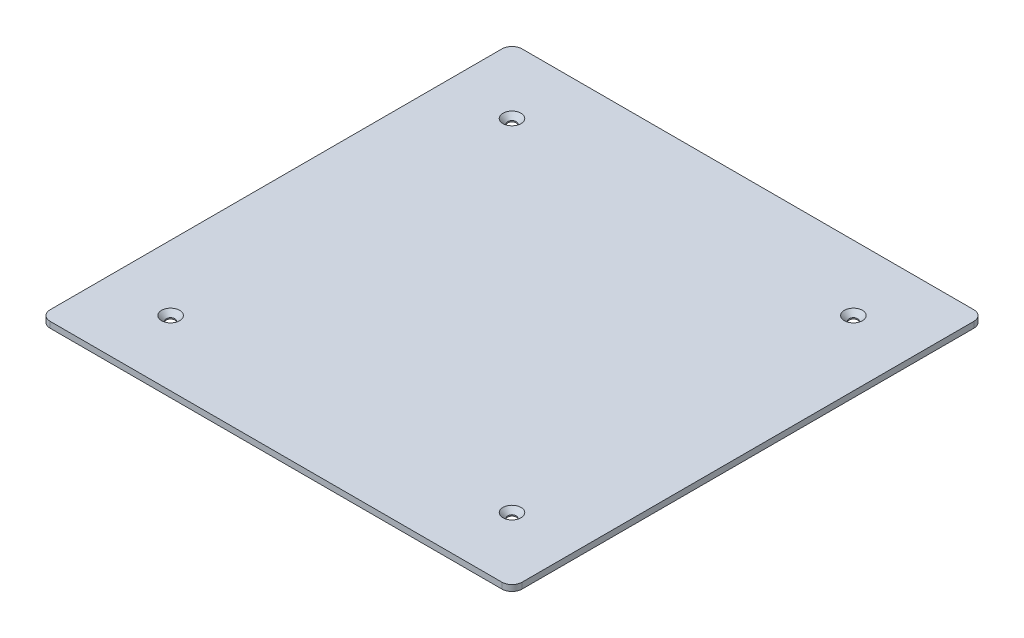
ISO-10303-21;
HEADER;
FILE_DESCRIPTION(('STEP AP214'),'2;1');
FILE_NAME('part.step','',(''),(''),'','','');
FILE_SCHEMA(('AUTOMOTIVE_DESIGN { 1 0 10303 214 1 1 1 1 }'));
ENDSEC;
DATA;
#1=APPLICATION_CONTEXT('core data for automotive mechanical design processes');
#2=APPLICATION_PROTOCOL_DEFINITION('international standard','automotive_design',2000,#1);
#3=PRODUCT_CONTEXT('',#1,'mechanical');
#4=PRODUCT('Part','Part','',(#3));
#5=PRODUCT_RELATED_PRODUCT_CATEGORY('part','',(#4));
#6=PRODUCT_DEFINITION_FORMATION('','',#4);
#7=PRODUCT_DEFINITION_CONTEXT('part definition',#1,'design');
#8=PRODUCT_DEFINITION('design','',#6,#7);
#9=PRODUCT_DEFINITION_SHAPE('','',#8);
#10=(LENGTH_UNIT() NAMED_UNIT(*) SI_UNIT(.MILLI.,.METRE.));
#11=(NAMED_UNIT(*) PLANE_ANGLE_UNIT() SI_UNIT($,.RADIAN.));
#12=(NAMED_UNIT(*) SI_UNIT($,.STERADIAN.) SOLID_ANGLE_UNIT());
#13=UNCERTAINTY_MEASURE_WITH_UNIT(LENGTH_MEASURE(1.E-05),#10,'distance_accuracy_value','');
#14=(GEOMETRIC_REPRESENTATION_CONTEXT(3) GLOBAL_UNCERTAINTY_ASSIGNED_CONTEXT((#13)) GLOBAL_UNIT_ASSIGNED_CONTEXT((#10,
#11,#12)) REPRESENTATION_CONTEXT('',''));
#15=CARTESIAN_POINT('',(0.,0.,0.));
#16=DIRECTION('',(0.,0.,1.));
#17=DIRECTION('',(1.,0.,0.));
#18=AXIS2_PLACEMENT_3D('',#15,#16,#17);
#19=CARTESIAN_POINT('',(0.,3.,117.5));
#20=DIRECTION('',(0.,0.,-1.));
#21=DIRECTION('',(-1.,0.,0.));
#22=AXIS2_PLACEMENT_3D('',#19,#20,#21);
#23=PLANE('',#22);
#24=DIRECTION('',(1.,0.,0.));
#25=VECTOR('',#24,1.);
#26=CARTESIAN_POINT('',(0.,3.,117.5));
#27=LINE('',#26,#25);
#28=CARTESIAN_POINT('',(-112.5,3.,117.5));
#29=VERTEX_POINT('',#28);
#30=CARTESIAN_POINT('',(112.5,3.,117.5));
#31=VERTEX_POINT('',#30);
#32=EDGE_CURVE('E130',#29,#31,#27,.T.);
#33=ORIENTED_EDGE('',*,*,#32,.F.);
#34=DIRECTION('',(0.,-1.,0.));
#35=VECTOR('',#34,1.);
#36=CARTESIAN_POINT('',(-112.5,0.,117.5));
#37=LINE('',#36,#35);
#38=CARTESIAN_POINT('',(-112.5,0.,117.5));
#39=VERTEX_POINT('',#38);
#40=EDGE_CURVE('E115',#29,#39,#37,.T.);
#41=ORIENTED_EDGE('',*,*,#40,.T.);
#42=DIRECTION('',(1.,0.,0.));
#43=VECTOR('',#42,1.);
#44=CARTESIAN_POINT('',(0.,0.,117.5));
#45=LINE('',#44,#43);
#46=CARTESIAN_POINT('',(112.5,0.,117.5));
#47=VERTEX_POINT('',#46);
#48=EDGE_CURVE('E127',#39,#47,#45,.T.);
#49=ORIENTED_EDGE('',*,*,#48,.T.);
#50=DIRECTION('',(0.,-1.,0.));
#51=VECTOR('',#50,1.);
#52=CARTESIAN_POINT('',(112.5,3.,117.5));
#53=LINE('',#52,#51);
#54=EDGE_CURVE('E132',#47,#31,#53,.F.);
#55=ORIENTED_EDGE('',*,*,#54,.T.);
#56=EDGE_LOOP('',(#33,#41,#49,#55));
#57=FACE_BOUND('',#56,.T.);
#58=ADVANCED_FACE('F43',(#57),#23,.F.);
#59=CARTESIAN_POINT('',(117.5,3.,0.));
#60=DIRECTION('',(-1.,0.,0.));
#61=DIRECTION('',(0.,0.,1.));
#62=AXIS2_PLACEMENT_3D('',#59,#60,#61);
#63=PLANE('',#62);
#64=DIRECTION('',(0.,0.,-1.));
#65=VECTOR('',#64,1.);
#66=CARTESIAN_POINT('',(117.5,0.,0.));
#67=LINE('',#66,#65);
#68=CARTESIAN_POINT('',(117.5,0.,112.5));
#69=VERTEX_POINT('',#68);
#70=CARTESIAN_POINT('',(117.5,0.,-112.5));
#71=VERTEX_POINT('',#70);
#72=EDGE_CURVE('E136',#69,#71,#67,.T.);
#73=ORIENTED_EDGE('',*,*,#72,.T.);
#74=DIRECTION('',(0.,-1.,0.));
#75=VECTOR('',#74,1.);
#76=CARTESIAN_POINT('',(117.5,3.,-112.5));
#77=LINE('',#76,#75);
#78=CARTESIAN_POINT('',(117.5,3.,-112.5));
#79=VERTEX_POINT('',#78);
#80=EDGE_CURVE('E175',#71,#79,#77,.F.);
#81=ORIENTED_EDGE('',*,*,#80,.T.);
#82=DIRECTION('',(0.,0.,-1.));
#83=VECTOR('',#82,1.);
#84=CARTESIAN_POINT('',(117.5,3.,0.));
#85=LINE('',#84,#83);
#86=CARTESIAN_POINT('',(117.5,3.,112.5));
#87=VERTEX_POINT('',#86);
#88=EDGE_CURVE('E219',#87,#79,#85,.T.);
#89=ORIENTED_EDGE('',*,*,#88,.F.);
#90=DIRECTION('',(0.,-1.,0.));
#91=VECTOR('',#90,1.);
#92=CARTESIAN_POINT('',(117.5,3.,112.5));
#93=LINE('',#92,#91);
#94=EDGE_CURVE('E172',#87,#69,#93,.T.);
#95=ORIENTED_EDGE('',*,*,#94,.T.);
#96=EDGE_LOOP('',(#73,#81,#89,#95));
#97=FACE_BOUND('',#96,.T.);
#98=ADVANCED_FACE('F250',(#97),#63,.F.);
#99=CARTESIAN_POINT('',(0.,3.,-117.5));
#100=DIRECTION('',(0.,0.,-1.));
#101=DIRECTION('',(-1.,0.,0.));
#102=AXIS2_PLACEMENT_3D('',#99,#100,#101);
#103=PLANE('',#102);
#104=DIRECTION('',(1.,0.,0.));
#105=VECTOR('',#104,1.);
#106=CARTESIAN_POINT('',(0.,0.,-117.5));
#107=LINE('',#106,#105);
#108=CARTESIAN_POINT('',(-112.5,0.,-117.5));
#109=VERTEX_POINT('',#108);
#110=CARTESIAN_POINT('',(112.5,0.,-117.5));
#111=VERTEX_POINT('',#110);
#112=EDGE_CURVE('E140',#109,#111,#107,.T.);
#113=ORIENTED_EDGE('',*,*,#112,.F.);
#114=DIRECTION('',(0.,-1.,0.));
#115=VECTOR('',#114,1.);
#116=CARTESIAN_POINT('',(-112.5,3.,-117.5));
#117=LINE('',#116,#115);
#118=CARTESIAN_POINT('',(-112.5,3.,-117.5));
#119=VERTEX_POINT('',#118);
#120=EDGE_CURVE('E66',#109,#119,#117,.F.);
#121=ORIENTED_EDGE('',*,*,#120,.T.);
#122=DIRECTION('',(1.,0.,0.));
#123=VECTOR('',#122,1.);
#124=CARTESIAN_POINT('',(0.,3.,-117.5));
#125=LINE('',#124,#123);
#126=CARTESIAN_POINT('',(112.5,3.,-117.5));
#127=VERTEX_POINT('',#126);
#128=EDGE_CURVE('E218',#119,#127,#125,.T.);
#129=ORIENTED_EDGE('',*,*,#128,.T.);
#130=DIRECTION('',(0.,-1.,0.));
#131=VECTOR('',#130,1.);
#132=CARTESIAN_POINT('',(112.5,0.,-117.5));
#133=LINE('',#132,#131);
#134=EDGE_CURVE('E168',#127,#111,#133,.T.);
#135=ORIENTED_EDGE('',*,*,#134,.T.);
#136=EDGE_LOOP('',(#113,#121,#129,#135));
#137=FACE_BOUND('',#136,.T.);
#138=ADVANCED_FACE('F255',(#137),#103,.T.);
#139=CARTESIAN_POINT('',(-117.5,3.,0.));
#140=DIRECTION('',(-1.,0.,0.));
#141=DIRECTION('',(0.,0.,1.));
#142=AXIS2_PLACEMENT_3D('',#139,#140,#141);
#143=PLANE('',#142);
#144=DIRECTION('',(0.,0.,-1.));
#145=VECTOR('',#144,1.);
#146=CARTESIAN_POINT('',(-117.5,0.,0.));
#147=LINE('',#146,#145);
#148=CARTESIAN_POINT('',(-117.5,0.,112.5));
#149=VERTEX_POINT('',#148);
#150=CARTESIAN_POINT('',(-117.5,0.,-112.5));
#151=VERTEX_POINT('',#150);
#152=EDGE_CURVE('E151',#149,#151,#147,.T.);
#153=ORIENTED_EDGE('',*,*,#152,.F.);
#154=DIRECTION('',(0.,-1.,0.));
#155=VECTOR('',#154,1.);
#156=CARTESIAN_POINT('',(-117.5,3.,112.5));
#157=LINE('',#156,#155);
#158=CARTESIAN_POINT('',(-117.5,3.,112.5));
#159=VERTEX_POINT('',#158);
#160=EDGE_CURVE('E116',#149,#159,#157,.F.);
#161=ORIENTED_EDGE('',*,*,#160,.T.);
#162=DIRECTION('',(0.,0.,-1.));
#163=VECTOR('',#162,1.);
#164=CARTESIAN_POINT('',(-117.5,3.,0.));
#165=LINE('',#164,#163);
#166=CARTESIAN_POINT('',(-117.5,3.,-112.5));
#167=VERTEX_POINT('',#166);
#168=EDGE_CURVE('E146',#159,#167,#165,.T.);
#169=ORIENTED_EDGE('',*,*,#168,.T.);
#170=DIRECTION('',(0.,-1.,0.));
#171=VECTOR('',#170,1.);
#172=CARTESIAN_POINT('',(-117.5,3.,-112.5));
#173=LINE('',#172,#171);
#174=EDGE_CURVE('E121',#167,#151,#173,.T.);
#175=ORIENTED_EDGE('',*,*,#174,.T.);
#176=EDGE_LOOP('',(#153,#161,#169,#175));
#177=FACE_BOUND('',#176,.T.);
#178=ADVANCED_FACE('F209',(#177),#143,.T.);
#179=CARTESIAN_POINT('',(0.,3.,0.));
#180=DIRECTION('',(0.,1.,0.));
#181=DIRECTION('',(0.,0.,1.));
#182=AXIS2_PLACEMENT_3D('',#179,#180,#181);
#183=PLANE('',#182);
#184=CARTESIAN_POINT('',(-85.,3.,85.));
#185=DIRECTION('',(0.,1.,0.));
#186=DIRECTION('',(0.,0.,1.));
#187=AXIS2_PLACEMENT_3D('',#184,#185,#186);
#188=CIRCLE('',#187,4.50000000000012);
#189=CARTESIAN_POINT('',(-85.,3.,89.5000000000001));
#190=VERTEX_POINT('',#189);
#191=EDGE_CURVE('E186',#190,#190,#188,.F.);
#192=ORIENTED_EDGE('',*,*,#191,.T.);
#193=EDGE_LOOP('',(#192));
#194=FACE_BOUND('',#193,.T.);
#195=CARTESIAN_POINT('',(85.,3.,85.));
#196=DIRECTION('',(0.,1.,0.));
#197=DIRECTION('',(0.,0.,1.));
#198=AXIS2_PLACEMENT_3D('',#195,#196,#197);
#199=CIRCLE('',#198,4.50000000000012);
#200=CARTESIAN_POINT('',(85.,3.,89.5000000000001));
#201=VERTEX_POINT('',#200);
#202=EDGE_CURVE('E183',#201,#201,#199,.F.);
#203=ORIENTED_EDGE('',*,*,#202,.T.);
#204=EDGE_LOOP('',(#203));
#205=FACE_BOUND('',#204,.T.);
#206=CARTESIAN_POINT('',(85.,3.,-85.));
#207=DIRECTION('',(0.,1.,0.));
#208=DIRECTION('',(0.,0.,1.));
#209=AXIS2_PLACEMENT_3D('',#206,#207,#208);
#210=CIRCLE('',#209,4.50000000000012);
#211=CARTESIAN_POINT('',(85.,3.,-80.4999999999999));
#212=VERTEX_POINT('',#211);
#213=EDGE_CURVE('E180',#212,#212,#210,.F.);
#214=ORIENTED_EDGE('',*,*,#213,.T.);
#215=EDGE_LOOP('',(#214));
#216=FACE_BOUND('',#215,.T.);
#217=CARTESIAN_POINT('',(-85.,3.,-85.));
#218=DIRECTION('',(0.,1.,0.));
#219=DIRECTION('',(0.,0.,1.));
#220=AXIS2_PLACEMENT_3D('',#217,#218,#219);
#221=CIRCLE('',#220,4.50000000000012);
#222=CARTESIAN_POINT('',(-85.,3.,-80.4999999999999));
#223=VERTEX_POINT('',#222);
#224=EDGE_CURVE('E177',#223,#223,#221,.F.);
#225=ORIENTED_EDGE('',*,*,#224,.T.);
#226=EDGE_LOOP('',(#225));
#227=FACE_BOUND('',#226,.T.);
#228=ORIENTED_EDGE('',*,*,#168,.F.);
#229=CARTESIAN_POINT('',(-112.5,3.,112.5));
#230=DIRECTION('',(0.,1.,0.));
#231=DIRECTION('',(0.,0.,1.));
#232=AXIS2_PLACEMENT_3D('',#229,#230,#231);
#233=CIRCLE('',#232,5.);
#234=EDGE_CURVE('E166',#159,#29,#233,.T.);
#235=ORIENTED_EDGE('',*,*,#234,.T.);
#236=ORIENTED_EDGE('',*,*,#32,.T.);
#237=CARTESIAN_POINT('',(112.5,3.,112.5));
#238=DIRECTION('',(0.,1.,0.));
#239=DIRECTION('',(0.,0.,1.));
#240=AXIS2_PLACEMENT_3D('',#237,#238,#239);
#241=CIRCLE('',#240,5.);
#242=EDGE_CURVE('E161',#31,#87,#241,.T.);
#243=ORIENTED_EDGE('',*,*,#242,.T.);
#244=ORIENTED_EDGE('',*,*,#88,.T.);
#245=CARTESIAN_POINT('',(112.5,3.,-112.5));
#246=DIRECTION('',(0.,1.,0.));
#247=DIRECTION('',(0.,0.,1.));
#248=AXIS2_PLACEMENT_3D('',#245,#246,#247);
#249=CIRCLE('',#248,5.);
#250=EDGE_CURVE('E59',#79,#127,#249,.T.);
#251=ORIENTED_EDGE('',*,*,#250,.T.);
#252=ORIENTED_EDGE('',*,*,#128,.F.);
#253=CARTESIAN_POINT('',(-112.5,3.,-112.5));
#254=DIRECTION('',(0.,1.,0.));
#255=DIRECTION('',(0.,0.,1.));
#256=AXIS2_PLACEMENT_3D('',#253,#254,#255);
#257=CIRCLE('',#256,5.);
#258=EDGE_CURVE('E164',#119,#167,#257,.T.);
#259=ORIENTED_EDGE('',*,*,#258,.T.);
#260=EDGE_LOOP('',(#228,#235,#236,#243,#244,#251,#252,#259));
#261=FACE_BOUND('',#260,.T.);
#262=ADVANCED_FACE('F206',(#194,#205,#216,#227,#261),#183,.T.);
#263=CARTESIAN_POINT('',(0.,0.,0.));
#264=DIRECTION('',(0.,1.,0.));
#265=DIRECTION('',(0.,0.,1.));
#266=AXIS2_PLACEMENT_3D('',#263,#264,#265);
#267=PLANE('',#266);
#268=CARTESIAN_POINT('',(-85.,0.,-85.));
#269=DIRECTION('',(0.,-1.,0.));
#270=DIRECTION('',(0.,0.,-1.));
#271=AXIS2_PLACEMENT_3D('',#268,#269,#270);
#272=CIRCLE('',#271,2.1);
#273=CARTESIAN_POINT('',(-85.,0.,-87.1));
#274=VERTEX_POINT('',#273);
#275=EDGE_CURVE('E224',#274,#274,#272,.T.);
#276=ORIENTED_EDGE('',*,*,#275,.F.);
#277=EDGE_LOOP('',(#276));
#278=FACE_BOUND('',#277,.T.);
#279=CARTESIAN_POINT('',(85.,0.,85.));
#280=DIRECTION('',(0.,-1.,0.));
#281=DIRECTION('',(0.,0.,-1.));
#282=AXIS2_PLACEMENT_3D('',#279,#280,#281);
#283=CIRCLE('',#282,2.1);
#284=CARTESIAN_POINT('',(85.,0.,82.9));
#285=VERTEX_POINT('',#284);
#286=EDGE_CURVE('E227',#285,#285,#283,.T.);
#287=ORIENTED_EDGE('',*,*,#286,.F.);
#288=EDGE_LOOP('',(#287));
#289=FACE_BOUND('',#288,.T.);
#290=CARTESIAN_POINT('',(-85.,0.,85.));
#291=DIRECTION('',(0.,-1.,0.));
#292=DIRECTION('',(0.,0.,-1.));
#293=AXIS2_PLACEMENT_3D('',#290,#291,#292);
#294=CIRCLE('',#293,2.1);
#295=CARTESIAN_POINT('',(-85.,0.,82.9));
#296=VERTEX_POINT('',#295);
#297=EDGE_CURVE('E143',#296,#296,#294,.T.);
#298=ORIENTED_EDGE('',*,*,#297,.F.);
#299=EDGE_LOOP('',(#298));
#300=FACE_BOUND('',#299,.T.);
#301=CARTESIAN_POINT('',(85.,0.,-85.));
#302=DIRECTION('',(0.,-1.,0.));
#303=DIRECTION('',(0.,0.,-1.));
#304=AXIS2_PLACEMENT_3D('',#301,#302,#303);
#305=CIRCLE('',#304,2.1);
#306=CARTESIAN_POINT('',(85.,0.,-87.1));
#307=VERTEX_POINT('',#306);
#308=EDGE_CURVE('E137',#307,#307,#305,.T.);
#309=ORIENTED_EDGE('',*,*,#308,.F.);
#310=EDGE_LOOP('',(#309));
#311=FACE_BOUND('',#310,.T.);
#312=ORIENTED_EDGE('',*,*,#48,.F.);
#313=CARTESIAN_POINT('',(-112.5,0.,112.5));
#314=DIRECTION('',(0.,1.,0.));
#315=DIRECTION('',(0.,0.,1.));
#316=AXIS2_PLACEMENT_3D('',#313,#314,#315);
#317=CIRCLE('',#316,5.);
#318=EDGE_CURVE('E111',#39,#149,#317,.F.);
#319=ORIENTED_EDGE('',*,*,#318,.T.);
#320=ORIENTED_EDGE('',*,*,#152,.T.);
#321=CARTESIAN_POINT('',(-112.5,0.,-112.5));
#322=DIRECTION('',(0.,1.,0.));
#323=DIRECTION('',(0.,0.,1.));
#324=AXIS2_PLACEMENT_3D('',#321,#322,#323);
#325=CIRCLE('',#324,5.);
#326=EDGE_CURVE('E122',#151,#109,#325,.F.);
#327=ORIENTED_EDGE('',*,*,#326,.T.);
#328=ORIENTED_EDGE('',*,*,#112,.T.);
#329=CARTESIAN_POINT('',(112.5,0.,-112.5));
#330=DIRECTION('',(0.,1.,0.));
#331=DIRECTION('',(0.,0.,1.));
#332=AXIS2_PLACEMENT_3D('',#329,#330,#331);
#333=CIRCLE('',#332,5.);
#334=EDGE_CURVE('E155',#111,#71,#333,.F.);
#335=ORIENTED_EDGE('',*,*,#334,.T.);
#336=ORIENTED_EDGE('',*,*,#72,.F.);
#337=CARTESIAN_POINT('',(112.5,0.,112.5));
#338=DIRECTION('',(0.,1.,0.));
#339=DIRECTION('',(0.,0.,1.));
#340=AXIS2_PLACEMENT_3D('',#337,#338,#339);
#341=CIRCLE('',#340,5.);
#342=EDGE_CURVE('E131',#69,#47,#341,.F.);
#343=ORIENTED_EDGE('',*,*,#342,.T.);
#344=EDGE_LOOP('',(#312,#319,#320,#327,#328,#335,#336,#343));
#345=FACE_BOUND('',#344,.T.);
#346=ADVANCED_FACE('F134',(#278,#289,#300,#311,#345),#267,.F.);
#347=CARTESIAN_POINT('',(85.,3.,-85.));
#348=DIRECTION('',(0.,-1.,0.));
#349=DIRECTION('',(0.,0.,-1.));
#350=AXIS2_PLACEMENT_3D('',#347,#348,#349);
#351=CYLINDRICAL_SURFACE('',#350,2.1);
#352=CARTESIAN_POINT('',(85.,0.59999999999988,-85.));
#353=DIRECTION('',(0.,1.,0.));
#354=DIRECTION('',(0.,0.,1.));
#355=AXIS2_PLACEMENT_3D('',#352,#353,#354);
#356=CIRCLE('',#355,2.1);
#357=CARTESIAN_POINT('',(85.,0.59999999999988,-82.9));
#358=VERTEX_POINT('',#357);
#359=EDGE_CURVE('E52',#358,#358,#356,.T.);
#360=ORIENTED_EDGE('',*,*,#359,.T.);
#361=EDGE_LOOP('',(#360));
#362=FACE_BOUND('',#361,.T.);
#363=ORIENTED_EDGE('',*,*,#308,.T.);
#364=EDGE_LOOP('',(#363));
#365=FACE_BOUND('',#364,.T.);
#366=ADVANCED_FACE('F197',(#362,#365),#351,.F.);
#367=CARTESIAN_POINT('',(-85.,3.,85.));
#368=DIRECTION('',(0.,-1.,0.));
#369=DIRECTION('',(0.,0.,-1.));
#370=AXIS2_PLACEMENT_3D('',#367,#368,#369);
#371=CYLINDRICAL_SURFACE('',#370,2.1);
#372=CARTESIAN_POINT('',(-85.,0.59999999999988,85.));
#373=DIRECTION('',(0.,1.,0.));
#374=DIRECTION('',(0.,0.,1.));
#375=AXIS2_PLACEMENT_3D('',#372,#373,#374);
#376=CIRCLE('',#375,2.1);
#377=CARTESIAN_POINT('',(-85.,0.59999999999988,87.1));
#378=VERTEX_POINT('',#377);
#379=EDGE_CURVE('E189',#378,#378,#376,.T.);
#380=ORIENTED_EDGE('',*,*,#379,.T.);
#381=EDGE_LOOP('',(#380));
#382=FACE_BOUND('',#381,.T.);
#383=ORIENTED_EDGE('',*,*,#297,.T.);
#384=EDGE_LOOP('',(#383));
#385=FACE_BOUND('',#384,.T.);
#386=ADVANCED_FACE('F233',(#382,#385),#371,.F.);
#387=CARTESIAN_POINT('',(85.,3.,85.));
#388=DIRECTION('',(0.,-1.,0.));
#389=DIRECTION('',(0.,0.,-1.));
#390=AXIS2_PLACEMENT_3D('',#387,#388,#389);
#391=CYLINDRICAL_SURFACE('',#390,2.1);
#392=CARTESIAN_POINT('',(85.,0.59999999999988,85.));
#393=DIRECTION('',(0.,1.,0.));
#394=DIRECTION('',(0.,0.,1.));
#395=AXIS2_PLACEMENT_3D('',#392,#393,#394);
#396=CIRCLE('',#395,2.1);
#397=CARTESIAN_POINT('',(85.,0.59999999999988,87.1));
#398=VERTEX_POINT('',#397);
#399=EDGE_CURVE('E192',#398,#398,#396,.T.);
#400=ORIENTED_EDGE('',*,*,#399,.T.);
#401=EDGE_LOOP('',(#400));
#402=FACE_BOUND('',#401,.T.);
#403=ORIENTED_EDGE('',*,*,#286,.T.);
#404=EDGE_LOOP('',(#403));
#405=FACE_BOUND('',#404,.T.);
#406=ADVANCED_FACE('F245',(#402,#405),#391,.F.);
#407=CARTESIAN_POINT('',(-85.,3.,-85.));
#408=DIRECTION('',(0.,-1.,0.));
#409=DIRECTION('',(0.,0.,-1.));
#410=AXIS2_PLACEMENT_3D('',#407,#408,#409);
#411=CYLINDRICAL_SURFACE('',#410,2.1);
#412=CARTESIAN_POINT('',(-85.,0.59999999999988,-85.));
#413=DIRECTION('',(0.,1.,0.));
#414=DIRECTION('',(0.,0.,1.));
#415=AXIS2_PLACEMENT_3D('',#412,#413,#414);
#416=CIRCLE('',#415,2.1);
#417=CARTESIAN_POINT('',(-85.,0.59999999999988,-82.9));
#418=VERTEX_POINT('',#417);
#419=EDGE_CURVE('E11',#418,#418,#416,.T.);
#420=ORIENTED_EDGE('',*,*,#419,.T.);
#421=EDGE_LOOP('',(#420));
#422=FACE_BOUND('',#421,.T.);
#423=ORIENTED_EDGE('',*,*,#275,.T.);
#424=EDGE_LOOP('',(#423));
#425=FACE_BOUND('',#424,.T.);
#426=ADVANCED_FACE('F263',(#422,#425),#411,.F.);
#427=CARTESIAN_POINT('',(-112.5,3.,112.5));
#428=DIRECTION('',(0.,1.,0.));
#429=DIRECTION('',(0.,0.,1.));
#430=AXIS2_PLACEMENT_3D('',#427,#428,#429);
#431=CYLINDRICAL_SURFACE('',#430,5.);
#432=ORIENTED_EDGE('',*,*,#234,.F.);
#433=ORIENTED_EDGE('',*,*,#160,.F.);
#434=ORIENTED_EDGE('',*,*,#318,.F.);
#435=ORIENTED_EDGE('',*,*,#40,.F.);
#436=EDGE_LOOP('',(#432,#433,#434,#435));
#437=FACE_BOUND('',#436,.T.);
#438=ADVANCED_FACE('F114',(#437),#431,.T.);
#439=CARTESIAN_POINT('',(-112.5,3.,-112.5));
#440=DIRECTION('',(0.,-1.,0.));
#441=DIRECTION('',(0.,0.,-1.));
#442=AXIS2_PLACEMENT_3D('',#439,#440,#441);
#443=CYLINDRICAL_SURFACE('',#442,5.);
#444=ORIENTED_EDGE('',*,*,#258,.F.);
#445=ORIENTED_EDGE('',*,*,#120,.F.);
#446=ORIENTED_EDGE('',*,*,#326,.F.);
#447=ORIENTED_EDGE('',*,*,#174,.F.);
#448=EDGE_LOOP('',(#444,#445,#446,#447));
#449=FACE_BOUND('',#448,.T.);
#450=ADVANCED_FACE('F262',(#449),#443,.T.);
#451=CARTESIAN_POINT('',(112.5,3.,-112.5));
#452=DIRECTION('',(0.,1.,0.));
#453=DIRECTION('',(0.,0.,1.));
#454=AXIS2_PLACEMENT_3D('',#451,#452,#453);
#455=CYLINDRICAL_SURFACE('',#454,5.);
#456=ORIENTED_EDGE('',*,*,#250,.F.);
#457=ORIENTED_EDGE('',*,*,#80,.F.);
#458=ORIENTED_EDGE('',*,*,#334,.F.);
#459=ORIENTED_EDGE('',*,*,#134,.F.);
#460=EDGE_LOOP('',(#456,#457,#458,#459));
#461=FACE_BOUND('',#460,.T.);
#462=ADVANCED_FACE('F266',(#461),#455,.T.);
#463=CARTESIAN_POINT('',(112.5,3.,112.5));
#464=DIRECTION('',(0.,-1.,0.));
#465=DIRECTION('',(0.,0.,-1.));
#466=AXIS2_PLACEMENT_3D('',#463,#464,#465);
#467=CYLINDRICAL_SURFACE('',#466,5.);
#468=ORIENTED_EDGE('',*,*,#242,.F.);
#469=ORIENTED_EDGE('',*,*,#54,.F.);
#470=ORIENTED_EDGE('',*,*,#342,.F.);
#471=ORIENTED_EDGE('',*,*,#94,.F.);
#472=EDGE_LOOP('',(#468,#469,#470,#471));
#473=FACE_BOUND('',#472,.T.);
#474=ADVANCED_FACE('F270',(#473),#467,.T.);
#475=CARTESIAN_POINT('',(-85.,3.,85.));
#476=DIRECTION('',(0.,1.,0.));
#477=DIRECTION('',(0.,0.,1.));
#478=AXIS2_PLACEMENT_3D('',#475,#476,#477);
#479=CONICAL_SURFACE('',#478,4.50000000000012,0.785398163397446);
#480=ORIENTED_EDGE('',*,*,#379,.F.);
#481=EDGE_LOOP('',(#480));
#482=FACE_BOUND('',#481,.T.);
#483=ORIENTED_EDGE('',*,*,#191,.F.);
#484=EDGE_LOOP('',(#483));
#485=FACE_BOUND('',#484,.T.);
#486=ADVANCED_FACE('F274',(#482,#485),#479,.F.);
#487=CARTESIAN_POINT('',(85.,3.,85.));
#488=DIRECTION('',(0.,1.,0.));
#489=DIRECTION('',(0.,0.,1.));
#490=AXIS2_PLACEMENT_3D('',#487,#488,#489);
#491=CONICAL_SURFACE('',#490,4.50000000000012,0.785398163397446);
#492=ORIENTED_EDGE('',*,*,#399,.F.);
#493=EDGE_LOOP('',(#492));
#494=FACE_BOUND('',#493,.T.);
#495=ORIENTED_EDGE('',*,*,#202,.F.);
#496=EDGE_LOOP('',(#495));
#497=FACE_BOUND('',#496,.T.);
#498=ADVANCED_FACE('F203',(#494,#497),#491,.F.);
#499=CARTESIAN_POINT('',(85.,3.,-85.));
#500=DIRECTION('',(0.,1.,0.));
#501=DIRECTION('',(0.,0.,1.));
#502=AXIS2_PLACEMENT_3D('',#499,#500,#501);
#503=CONICAL_SURFACE('',#502,4.50000000000012,0.785398163397446);
#504=ORIENTED_EDGE('',*,*,#359,.F.);
#505=EDGE_LOOP('',(#504));
#506=FACE_BOUND('',#505,.T.);
#507=ORIENTED_EDGE('',*,*,#213,.F.);
#508=EDGE_LOOP('',(#507));
#509=FACE_BOUND('',#508,.T.);
#510=ADVANCED_FACE('F200',(#506,#509),#503,.F.);
#511=CARTESIAN_POINT('',(-85.,3.,-85.));
#512=DIRECTION('',(0.,1.,0.));
#513=DIRECTION('',(0.,0.,1.));
#514=AXIS2_PLACEMENT_3D('',#511,#512,#513);
#515=CONICAL_SURFACE('',#514,4.50000000000012,0.785398163397446);
#516=ORIENTED_EDGE('',*,*,#419,.F.);
#517=EDGE_LOOP('',(#516));
#518=FACE_BOUND('',#517,.T.);
#519=ORIENTED_EDGE('',*,*,#224,.F.);
#520=EDGE_LOOP('',(#519));
#521=FACE_BOUND('',#520,.T.);
#522=ADVANCED_FACE('F46',(#518,#521),#515,.F.);
#523=CLOSED_SHELL('',(#58,#98,#138,#178,#262,#346,#366,#386,#406,#426,#438,#450,#462,#474,#486,
#498,#510,#522));
#524=MANIFOLD_SOLID_BREP('B2',#523);
#525=ADVANCED_BREP_SHAPE_REPRESENTATION('',(#18,#524),#14);
#526=SHAPE_DEFINITION_REPRESENTATION(#9,#525);
ENDSEC;
END-ISO-10303-21;
